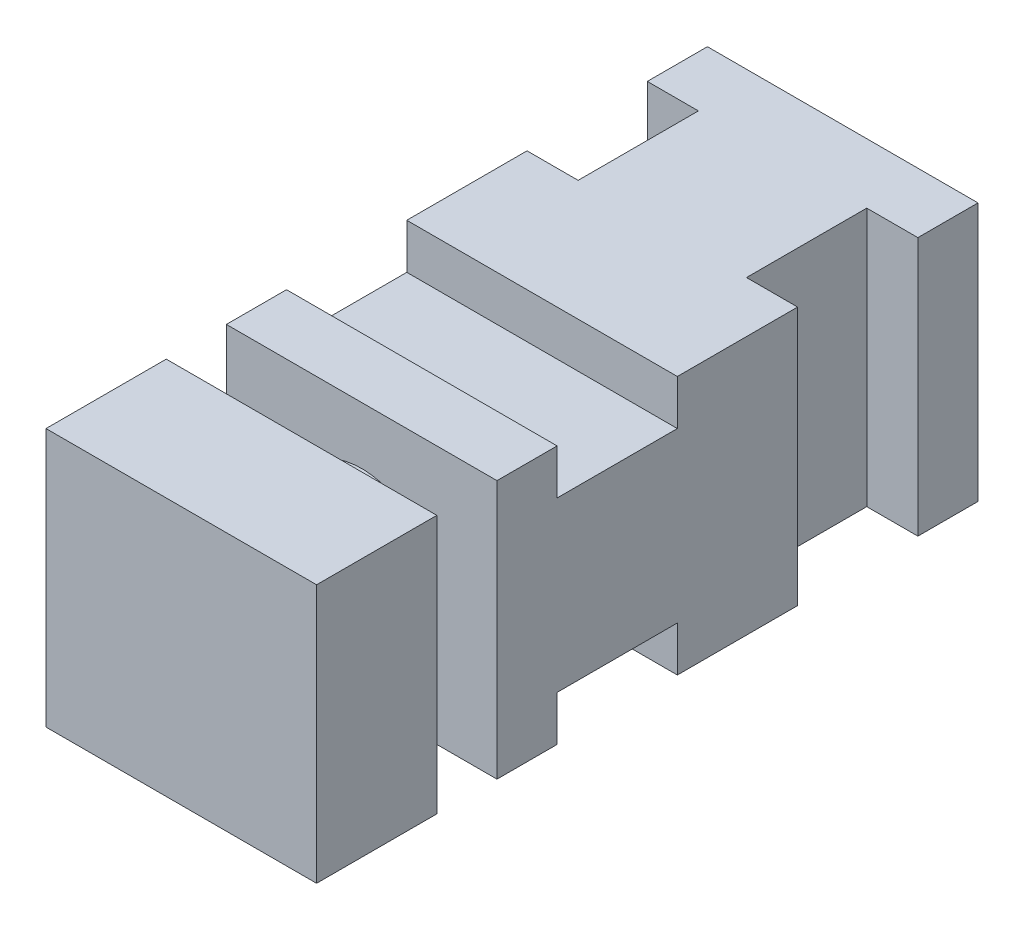
ISO-10303-21;
HEADER;
FILE_DESCRIPTION(('STEP AP214'),'2;1');
FILE_NAME('part.step','',(''),(''),'','','');
FILE_SCHEMA(('AUTOMOTIVE_DESIGN { 1 0 10303 214 1 1 1 1 }'));
ENDSEC;
DATA;
#1=APPLICATION_CONTEXT('core data for automotive mechanical design processes');
#2=APPLICATION_PROTOCOL_DEFINITION('international standard','automotive_design',2000,#1);
#3=PRODUCT_CONTEXT('',#1,'mechanical');
#4=PRODUCT('Part','Part','',(#3));
#5=PRODUCT_RELATED_PRODUCT_CATEGORY('part','',(#4));
#6=PRODUCT_DEFINITION_FORMATION('','',#4);
#7=PRODUCT_DEFINITION_CONTEXT('part definition',#1,'design');
#8=PRODUCT_DEFINITION('design','',#6,#7);
#9=PRODUCT_DEFINITION_SHAPE('','',#8);
#10=(LENGTH_UNIT() NAMED_UNIT(*) SI_UNIT(.MILLI.,.METRE.));
#11=(NAMED_UNIT(*) PLANE_ANGLE_UNIT() SI_UNIT($,.RADIAN.));
#12=(NAMED_UNIT(*) SI_UNIT($,.STERADIAN.) SOLID_ANGLE_UNIT());
#13=UNCERTAINTY_MEASURE_WITH_UNIT(LENGTH_MEASURE(1.E-05),#10,'distance_accuracy_value','');
#14=(GEOMETRIC_REPRESENTATION_CONTEXT(3) GLOBAL_UNCERTAINTY_ASSIGNED_CONTEXT((#13)) GLOBAL_UNIT_ASSIGNED_CONTEXT((#10,
#11,#12)) REPRESENTATION_CONTEXT('',''));
#15=CARTESIAN_POINT('',(0.,0.,0.));
#16=DIRECTION('',(0.,0.,1.));
#17=DIRECTION('',(1.,0.,0.));
#18=AXIS2_PLACEMENT_3D('',#15,#16,#17);
#19=CARTESIAN_POINT('',(-1.125,-1.075,-2.5));
#20=DIRECTION('',(1.,0.,0.));
#21=DIRECTION('',(0.,1.,0.));
#22=AXIS2_PLACEMENT_3D('',#19,#20,#21);
#23=PLANE('',#22);
#24=DIRECTION('',(0.,0.,1.));
#25=VECTOR('',#24,1.);
#26=CARTESIAN_POINT('',(-1.125,-1.075,-2.5));
#27=LINE('',#26,#25);
#28=CARTESIAN_POINT('',(-1.125,-1.075,-4.5));
#29=VERTEX_POINT('',#28);
#30=CARTESIAN_POINT('',(-1.125,-1.075,-4.));
#31=VERTEX_POINT('',#30);
#32=EDGE_CURVE('E393',#29,#31,#27,.T.);
#33=ORIENTED_EDGE('',*,*,#32,.T.);
#34=DIRECTION('',(0.,-1.,0.));
#35=VECTOR('',#34,1.);
#36=CARTESIAN_POINT('',(-1.125,1.075,-4.));
#37=LINE('',#36,#35);
#38=CARTESIAN_POINT('',(-1.125,1.075,-4.));
#39=VERTEX_POINT('',#38);
#40=EDGE_CURVE('E236',#39,#31,#37,.T.);
#41=ORIENTED_EDGE('',*,*,#40,.F.);
#42=DIRECTION('',(0.,0.,1.));
#43=VECTOR('',#42,1.);
#44=CARTESIAN_POINT('',(-1.125,1.075,-2.5));
#45=LINE('',#44,#43);
#46=CARTESIAN_POINT('',(-1.125,1.075,-4.5));
#47=VERTEX_POINT('',#46);
#48=EDGE_CURVE('E225',#47,#39,#45,.T.);
#49=ORIENTED_EDGE('',*,*,#48,.F.);
#50=DIRECTION('',(0.,1.,0.));
#51=VECTOR('',#50,1.);
#52=CARTESIAN_POINT('',(-1.125,-1.075,-4.5));
#53=LINE('',#52,#51);
#54=EDGE_CURVE('E285',#29,#47,#53,.T.);
#55=ORIENTED_EDGE('',*,*,#54,.F.);
#56=EDGE_LOOP('',(#33,#41,#49,#55));
#57=FACE_BOUND('',#56,.T.);
#58=ADVANCED_FACE('F39',(#57),#23,.F.);
#59=CARTESIAN_POINT('',(1.125,-1.075,-2.5));
#60=DIRECTION('',(-1.,0.,0.));
#61=DIRECTION('',(0.,-1.,0.));
#62=AXIS2_PLACEMENT_3D('',#59,#60,#61);
#63=PLANE('',#62);
#64=DIRECTION('',(0.,0.,1.));
#65=VECTOR('',#64,1.);
#66=CARTESIAN_POINT('',(1.125,1.075,-2.5));
#67=LINE('',#66,#65);
#68=CARTESIAN_POINT('',(1.125,1.075,-4.5));
#69=VERTEX_POINT('',#68);
#70=CARTESIAN_POINT('',(1.125,1.075,-4.));
#71=VERTEX_POINT('',#70);
#72=EDGE_CURVE('E405',#69,#71,#67,.T.);
#73=ORIENTED_EDGE('',*,*,#72,.T.);
#74=DIRECTION('',(0.,-1.,0.));
#75=VECTOR('',#74,1.);
#76=CARTESIAN_POINT('',(1.125,1.075,-4.));
#77=LINE('',#76,#75);
#78=CARTESIAN_POINT('',(1.125,-1.075,-4.));
#79=VERTEX_POINT('',#78);
#80=EDGE_CURVE('E227',#71,#79,#77,.T.);
#81=ORIENTED_EDGE('',*,*,#80,.T.);
#82=DIRECTION('',(0.,0.,1.));
#83=VECTOR('',#82,1.);
#84=CARTESIAN_POINT('',(1.125,-1.075,-2.5));
#85=LINE('',#84,#83);
#86=CARTESIAN_POINT('',(1.125,-1.075,-4.5));
#87=VERTEX_POINT('',#86);
#88=EDGE_CURVE('E399',#87,#79,#85,.T.);
#89=ORIENTED_EDGE('',*,*,#88,.F.);
#90=DIRECTION('',(0.,-1.,0.));
#91=VECTOR('',#90,1.);
#92=CARTESIAN_POINT('',(1.125,-1.075,-4.5));
#93=LINE('',#92,#91);
#94=EDGE_CURVE('E293',#69,#87,#93,.T.);
#95=ORIENTED_EDGE('',*,*,#94,.F.);
#96=EDGE_LOOP('',(#73,#81,#89,#95));
#97=FACE_BOUND('',#96,.T.);
#98=ADVANCED_FACE('F489',(#97),#63,.F.);
#99=CARTESIAN_POINT('',(-1.125,1.075,-3.));
#100=VERTEX_POINT('',#99);
#101=CARTESIAN_POINT('',(-1.125,1.075,-2.));
#102=VERTEX_POINT('',#101);
#103=EDGE_CURVE('E414',#100,#102,#45,.T.);
#104=ORIENTED_EDGE('',*,*,#103,.F.);
#105=DIRECTION('',(0.,-1.,0.));
#106=VECTOR('',#105,1.);
#107=CARTESIAN_POINT('',(-1.125,1.075,-3.));
#108=LINE('',#107,#106);
#109=CARTESIAN_POINT('',(-1.125,-1.075,-3.));
#110=VERTEX_POINT('',#109);
#111=EDGE_CURVE('E240',#100,#110,#108,.T.);
#112=ORIENTED_EDGE('',*,*,#111,.T.);
#113=CARTESIAN_POINT('',(-1.125,-1.075,-2.));
#114=VERTEX_POINT('',#113);
#115=EDGE_CURVE('E398',#110,#114,#27,.T.);
#116=ORIENTED_EDGE('',*,*,#115,.T.);
#117=DIRECTION('',(0.,-1.,0.));
#118=VECTOR('',#117,1.);
#119=CARTESIAN_POINT('',(-1.125,-1.075,-2.));
#120=LINE('',#119,#118);
#121=CARTESIAN_POINT('',(-1.125,-0.7,-2.));
#122=VERTEX_POINT('',#121);
#123=EDGE_CURVE('E358',#122,#114,#120,.T.);
#124=ORIENTED_EDGE('',*,*,#123,.F.);
#125=DIRECTION('',(0.,0.,1.));
#126=VECTOR('',#125,1.);
#127=CARTESIAN_POINT('',(-1.125,-0.7,-2.5));
#128=LINE('',#127,#126);
#129=CARTESIAN_POINT('',(-1.125,-0.7,-1.));
#130=VERTEX_POINT('',#129);
#131=EDGE_CURVE('E372',#122,#130,#128,.T.);
#132=ORIENTED_EDGE('',*,*,#131,.T.);
#133=DIRECTION('',(0.,-1.,0.));
#134=VECTOR('',#133,1.);
#135=CARTESIAN_POINT('',(-1.125,-1.075,-1.));
#136=LINE('',#135,#134);
#137=CARTESIAN_POINT('',(-1.125,-1.075,-1.));
#138=VERTEX_POINT('',#137);
#139=EDGE_CURVE('E319',#130,#138,#136,.T.);
#140=ORIENTED_EDGE('',*,*,#139,.T.);
#141=CARTESIAN_POINT('',(-1.125,-1.075,-0.5));
#142=VERTEX_POINT('',#141);
#143=EDGE_CURVE('E392',#138,#142,#27,.T.);
#144=ORIENTED_EDGE('',*,*,#143,.T.);
#145=DIRECTION('',(0.,1.,0.));
#146=VECTOR('',#145,1.);
#147=CARTESIAN_POINT('',(-1.125,-1.075,-0.5));
#148=LINE('',#147,#146);
#149=CARTESIAN_POINT('',(-1.125,1.075,-0.5));
#150=VERTEX_POINT('',#149);
#151=EDGE_CURVE('E376',#142,#150,#148,.T.);
#152=ORIENTED_EDGE('',*,*,#151,.T.);
#153=CARTESIAN_POINT('',(-1.125,1.075,-1.));
#154=VERTEX_POINT('',#153);
#155=EDGE_CURVE('E409',#154,#150,#45,.T.);
#156=ORIENTED_EDGE('',*,*,#155,.F.);
#157=DIRECTION('',(0.,1.,0.));
#158=VECTOR('',#157,1.);
#159=CARTESIAN_POINT('',(-1.125,-1.075,-1.));
#160=LINE('',#159,#158);
#161=CARTESIAN_POINT('',(-1.125,0.7,-1.));
#162=VERTEX_POINT('',#161);
#163=EDGE_CURVE('E369',#162,#154,#160,.T.);
#164=ORIENTED_EDGE('',*,*,#163,.F.);
#165=DIRECTION('',(0.,0.,1.));
#166=VECTOR('',#165,1.);
#167=CARTESIAN_POINT('',(-1.125,0.7,-2.5));
#168=LINE('',#167,#166);
#169=CARTESIAN_POINT('',(-1.125,0.7,-2.));
#170=VERTEX_POINT('',#169);
#171=EDGE_CURVE('E366',#170,#162,#168,.T.);
#172=ORIENTED_EDGE('',*,*,#171,.F.);
#173=DIRECTION('',(0.,1.,0.));
#174=VECTOR('',#173,1.);
#175=CARTESIAN_POINT('',(-1.125,-1.075,-2.));
#176=LINE('',#175,#174);
#177=EDGE_CURVE('E362',#170,#102,#176,.T.);
#178=ORIENTED_EDGE('',*,*,#177,.T.);
#179=EDGE_LOOP('',(#104,#112,#116,#124,#132,#140,#144,#152,#156,#164,#172,#178));
#180=FACE_BOUND('',#179,.T.);
#181=ADVANCED_FACE('F492',(#180),#23,.F.);
#182=CARTESIAN_POINT('',(1.125,1.075,-2.5));
#183=DIRECTION('',(0.,-1.,0.));
#184=DIRECTION('',(0.,0.,-1.));
#185=AXIS2_PLACEMENT_3D('',#182,#183,#184);
#186=PLANE('',#185);
#187=DIRECTION('',(-1.,0.,0.));
#188=VECTOR('',#187,1.);
#189=CARTESIAN_POINT('',(1.125,1.075,-1.));
#190=LINE('',#189,#188);
#191=CARTESIAN_POINT('',(1.125,1.075,-1.));
#192=VERTEX_POINT('',#191);
#193=EDGE_CURVE('E307',#192,#154,#190,.T.);
#194=ORIENTED_EDGE('',*,*,#193,.T.);
#195=ORIENTED_EDGE('',*,*,#155,.T.);
#196=DIRECTION('',(1.,0.,0.));
#197=VECTOR('',#196,1.);
#198=CARTESIAN_POINT('',(1.125,1.075,-0.5));
#199=LINE('',#198,#197);
#200=CARTESIAN_POINT('',(1.125,1.075,-0.5));
#201=VERTEX_POINT('',#200);
#202=EDGE_CURVE('E380',#150,#201,#199,.T.);
#203=ORIENTED_EDGE('',*,*,#202,.T.);
#204=EDGE_CURVE('E403',#192,#201,#67,.T.);
#205=ORIENTED_EDGE('',*,*,#204,.F.);
#206=EDGE_LOOP('',(#194,#195,#203,#205));
#207=FACE_BOUND('',#206,.T.);
#208=ADVANCED_FACE('F501',(#207),#186,.F.);
#209=CARTESIAN_POINT('',(1.125,-1.075,-3.));
#210=VERTEX_POINT('',#209);
#211=CARTESIAN_POINT('',(1.125,-1.075,-2.));
#212=VERTEX_POINT('',#211);
#213=EDGE_CURVE('E404',#210,#212,#85,.T.);
#214=ORIENTED_EDGE('',*,*,#213,.F.);
#215=DIRECTION('',(0.,-1.,0.));
#216=VECTOR('',#215,1.);
#217=CARTESIAN_POINT('',(1.125,1.075,-3.));
#218=LINE('',#217,#216);
#219=CARTESIAN_POINT('',(1.125,1.075,-3.));
#220=VERTEX_POINT('',#219);
#221=EDGE_CURVE('E255',#220,#210,#218,.T.);
#222=ORIENTED_EDGE('',*,*,#221,.F.);
#223=CARTESIAN_POINT('',(1.125,1.075,-2.));
#224=VERTEX_POINT('',#223);
#225=EDGE_CURVE('E410',#220,#224,#67,.T.);
#226=ORIENTED_EDGE('',*,*,#225,.T.);
#227=DIRECTION('',(0.,-1.,0.));
#228=VECTOR('',#227,1.);
#229=CARTESIAN_POINT('',(1.125,0.,-2.));
#230=LINE('',#229,#228);
#231=CARTESIAN_POINT('',(1.125,0.699999999999999,-2.));
#232=VERTEX_POINT('',#231);
#233=EDGE_CURVE('E301',#224,#232,#230,.T.);
#234=ORIENTED_EDGE('',*,*,#233,.T.);
#235=DIRECTION('',(0.,0.,-1.));
#236=VECTOR('',#235,1.);
#237=CARTESIAN_POINT('',(1.125,0.699999999999999,0.));
#238=LINE('',#237,#236);
#239=CARTESIAN_POINT('',(1.125,0.699999999999999,-1.));
#240=VERTEX_POINT('',#239);
#241=EDGE_CURVE('E333',#240,#232,#238,.T.);
#242=ORIENTED_EDGE('',*,*,#241,.F.);
#243=DIRECTION('',(0.,-1.,0.));
#244=VECTOR('',#243,1.);
#245=CARTESIAN_POINT('',(1.125,0.,-1.));
#246=LINE('',#245,#244);
#247=EDGE_CURVE('E337',#192,#240,#246,.T.);
#248=ORIENTED_EDGE('',*,*,#247,.F.);
#249=ORIENTED_EDGE('',*,*,#204,.T.);
#250=DIRECTION('',(0.,-1.,0.));
#251=VECTOR('',#250,1.);
#252=CARTESIAN_POINT('',(1.125,-1.075,-0.5));
#253=LINE('',#252,#251);
#254=CARTESIAN_POINT('',(1.125,-1.075,-0.5));
#255=VERTEX_POINT('',#254);
#256=EDGE_CURVE('E384',#201,#255,#253,.T.);
#257=ORIENTED_EDGE('',*,*,#256,.T.);
#258=CARTESIAN_POINT('',(1.125,-1.075,-1.));
#259=VERTEX_POINT('',#258);
#260=EDGE_CURVE('E397',#259,#255,#85,.T.);
#261=ORIENTED_EDGE('',*,*,#260,.F.);
#262=DIRECTION('',(0.,1.,0.));
#263=VECTOR('',#262,1.);
#264=CARTESIAN_POINT('',(1.125,0.,-1.));
#265=LINE('',#264,#263);
#266=CARTESIAN_POINT('',(1.125,-0.7,-1.));
#267=VERTEX_POINT('',#266);
#268=EDGE_CURVE('E302',#259,#267,#265,.T.);
#269=ORIENTED_EDGE('',*,*,#268,.T.);
#270=DIRECTION('',(0.,0.,-1.));
#271=VECTOR('',#270,1.);
#272=CARTESIAN_POINT('',(1.125,-0.7,0.));
#273=LINE('',#272,#271);
#274=CARTESIAN_POINT('',(1.125,-0.7,-2.));
#275=VERTEX_POINT('',#274);
#276=EDGE_CURVE('E306',#267,#275,#273,.T.);
#277=ORIENTED_EDGE('',*,*,#276,.T.);
#278=DIRECTION('',(0.,1.,0.));
#279=VECTOR('',#278,1.);
#280=CARTESIAN_POINT('',(1.125,0.,-2.));
#281=LINE('',#280,#279);
#282=EDGE_CURVE('E311',#212,#275,#281,.T.);
#283=ORIENTED_EDGE('',*,*,#282,.F.);
#284=EDGE_LOOP('',(#214,#222,#226,#234,#242,#248,#249,#257,#261,#269,#277,#283));
#285=FACE_BOUND('',#284,.T.);
#286=ADVANCED_FACE('F498',(#285),#63,.F.);
#287=CARTESIAN_POINT('',(1.125,-1.075,-2.5));
#288=DIRECTION('',(0.,1.,0.));
#289=DIRECTION('',(0.,0.,1.));
#290=AXIS2_PLACEMENT_3D('',#287,#288,#289);
#291=PLANE('',#290);
#292=DIRECTION('',(0.,0.,-1.));
#293=VECTOR('',#292,1.);
#294=CARTESIAN_POINT('',(-0.7,-1.075,-2.5));
#295=LINE('',#294,#293);
#296=CARTESIAN_POINT('',(-0.7,-1.075,-3.));
#297=VERTEX_POINT('',#296);
#298=CARTESIAN_POINT('',(-0.7,-1.075,-4.));
#299=VERTEX_POINT('',#298);
#300=EDGE_CURVE('E276',#297,#299,#295,.T.);
#301=ORIENTED_EDGE('',*,*,#300,.T.);
#302=DIRECTION('',(-1.,0.,0.));
#303=VECTOR('',#302,1.);
#304=CARTESIAN_POINT('',(1.125,-1.075,-4.));
#305=LINE('',#304,#303);
#306=EDGE_CURVE('E210',#299,#31,#305,.T.);
#307=ORIENTED_EDGE('',*,*,#306,.T.);
#308=ORIENTED_EDGE('',*,*,#32,.F.);
#309=DIRECTION('',(-1.,0.,0.));
#310=VECTOR('',#309,1.);
#311=CARTESIAN_POINT('',(1.125,-1.075,-4.5));
#312=LINE('',#311,#310);
#313=EDGE_CURVE('E297',#87,#29,#312,.T.);
#314=ORIENTED_EDGE('',*,*,#313,.F.);
#315=ORIENTED_EDGE('',*,*,#88,.T.);
#316=DIRECTION('',(-1.,0.,0.));
#317=VECTOR('',#316,1.);
#318=CARTESIAN_POINT('',(1.125,-1.075,-4.));
#319=LINE('',#318,#317);
#320=CARTESIAN_POINT('',(0.7,-1.075,-4.));
#321=VERTEX_POINT('',#320);
#322=EDGE_CURVE('E272',#79,#321,#319,.T.);
#323=ORIENTED_EDGE('',*,*,#322,.T.);
#324=DIRECTION('',(0.,0.,1.));
#325=VECTOR('',#324,1.);
#326=CARTESIAN_POINT('',(0.7,-1.075,-2.5));
#327=LINE('',#326,#325);
#328=CARTESIAN_POINT('',(0.7,-1.075,-3.));
#329=VERTEX_POINT('',#328);
#330=EDGE_CURVE('E268',#321,#329,#327,.T.);
#331=ORIENTED_EDGE('',*,*,#330,.T.);
#332=DIRECTION('',(1.,0.,0.));
#333=VECTOR('',#332,1.);
#334=CARTESIAN_POINT('',(1.125,-1.075,-3.));
#335=LINE('',#334,#333);
#336=EDGE_CURVE('E239',#329,#210,#335,.T.);
#337=ORIENTED_EDGE('',*,*,#336,.T.);
#338=ORIENTED_EDGE('',*,*,#213,.T.);
#339=DIRECTION('',(-1.,0.,0.));
#340=VECTOR('',#339,1.);
#341=CARTESIAN_POINT('',(1.125,-1.075,-2.));
#342=LINE('',#341,#340);
#343=EDGE_CURVE('E315',#212,#114,#342,.T.);
#344=ORIENTED_EDGE('',*,*,#343,.T.);
#345=ORIENTED_EDGE('',*,*,#115,.F.);
#346=DIRECTION('',(1.,0.,0.));
#347=VECTOR('',#346,1.);
#348=CARTESIAN_POINT('',(1.125,-1.075,-3.));
#349=LINE('',#348,#347);
#350=EDGE_CURVE('E279',#110,#297,#349,.T.);
#351=ORIENTED_EDGE('',*,*,#350,.T.);
#352=EDGE_LOOP('',(#301,#307,#308,#314,#315,#323,#331,#337,#338,#344,#345,#351));
#353=FACE_BOUND('',#352,.T.);
#354=ADVANCED_FACE('F566',(#353),#291,.F.);
#355=CARTESIAN_POINT('',(1.125,-1.075,1.));
#356=DIRECTION('',(-1.,0.,0.));
#357=DIRECTION('',(0.,-1.,0.));
#358=AXIS2_PLACEMENT_3D('',#355,#356,#357);
#359=PLANE('',#358);
#360=DIRECTION('',(0.,1.,0.));
#361=VECTOR('',#360,1.);
#362=CARTESIAN_POINT('',(1.125,-1.075,0.));
#363=LINE('',#362,#361);
#364=CARTESIAN_POINT('',(1.125,-1.075,0.));
#365=VERTEX_POINT('',#364);
#366=CARTESIAN_POINT('',(1.125,1.075,0.));
#367=VERTEX_POINT('',#366);
#368=EDGE_CURVE('E417',#365,#367,#363,.T.);
#369=ORIENTED_EDGE('',*,*,#368,.T.);
#370=DIRECTION('',(0.,0.,-1.));
#371=VECTOR('',#370,1.);
#372=CARTESIAN_POINT('',(1.125,1.075,1.));
#373=LINE('',#372,#371);
#374=CARTESIAN_POINT('',(1.125,1.075,1.));
#375=VERTEX_POINT('',#374);
#376=EDGE_CURVE('E43',#375,#367,#373,.T.);
#377=ORIENTED_EDGE('',*,*,#376,.F.);
#378=DIRECTION('',(0.,1.,0.));
#379=VECTOR('',#378,1.);
#380=CARTESIAN_POINT('',(1.125,-1.075,1.));
#381=LINE('',#380,#379);
#382=CARTESIAN_POINT('',(1.125,-1.075,1.));
#383=VERTEX_POINT('',#382);
#384=EDGE_CURVE('E419',#383,#375,#381,.T.);
#385=ORIENTED_EDGE('',*,*,#384,.F.);
#386=DIRECTION('',(0.,0.,-1.));
#387=VECTOR('',#386,1.);
#388=CARTESIAN_POINT('',(1.125,-1.075,1.));
#389=LINE('',#388,#387);
#390=EDGE_CURVE('E433',#383,#365,#389,.T.);
#391=ORIENTED_EDGE('',*,*,#390,.T.);
#392=EDGE_LOOP('',(#369,#377,#385,#391));
#393=FACE_BOUND('',#392,.T.);
#394=ADVANCED_FACE('F41',(#393),#359,.F.);
#395=CARTESIAN_POINT('',(-1.125,1.075,1.));
#396=DIRECTION('',(0.,-1.,0.));
#397=DIRECTION('',(1.,0.,0.));
#398=AXIS2_PLACEMENT_3D('',#395,#396,#397);
#399=PLANE('',#398);
#400=DIRECTION('',(-1.,0.,0.));
#401=VECTOR('',#400,1.);
#402=CARTESIAN_POINT('',(-1.125,1.075,0.));
#403=LINE('',#402,#401);
#404=CARTESIAN_POINT('',(-1.125,1.075,0.));
#405=VERTEX_POINT('',#404);
#406=EDGE_CURVE('E437',#367,#405,#403,.T.);
#407=ORIENTED_EDGE('',*,*,#406,.T.);
#408=DIRECTION('',(0.,0.,-1.));
#409=VECTOR('',#408,1.);
#410=CARTESIAN_POINT('',(-1.125,1.075,1.));
#411=LINE('',#410,#409);
#412=CARTESIAN_POINT('',(-1.125,1.075,1.));
#413=VERTEX_POINT('',#412);
#414=EDGE_CURVE('E451',#413,#405,#411,.T.);
#415=ORIENTED_EDGE('',*,*,#414,.F.);
#416=DIRECTION('',(-1.,0.,0.));
#417=VECTOR('',#416,1.);
#418=CARTESIAN_POINT('',(-1.125,1.075,1.));
#419=LINE('',#418,#417);
#420=EDGE_CURVE('E423',#375,#413,#419,.T.);
#421=ORIENTED_EDGE('',*,*,#420,.F.);
#422=ORIENTED_EDGE('',*,*,#376,.T.);
#423=EDGE_LOOP('',(#407,#415,#421,#422));
#424=FACE_BOUND('',#423,.T.);
#425=ADVANCED_FACE('F462',(#424),#399,.F.);
#426=CARTESIAN_POINT('',(-1.125,-1.075,1.));
#427=DIRECTION('',(1.,0.,0.));
#428=DIRECTION('',(0.,0.,-1.));
#429=AXIS2_PLACEMENT_3D('',#426,#427,#428);
#430=PLANE('',#429);
#431=DIRECTION('',(0.,-1.,0.));
#432=VECTOR('',#431,1.);
#433=CARTESIAN_POINT('',(-1.125,-1.075,0.));
#434=LINE('',#433,#432);
#435=CARTESIAN_POINT('',(-1.125,-1.075,0.));
#436=VERTEX_POINT('',#435);
#437=EDGE_CURVE('E440',#405,#436,#434,.T.);
#438=ORIENTED_EDGE('',*,*,#437,.T.);
#439=DIRECTION('',(0.,0.,-1.));
#440=VECTOR('',#439,1.);
#441=CARTESIAN_POINT('',(-1.125,-1.075,1.));
#442=LINE('',#441,#440);
#443=CARTESIAN_POINT('',(-1.125,-1.075,1.));
#444=VERTEX_POINT('',#443);
#445=EDGE_CURVE('E448',#444,#436,#442,.T.);
#446=ORIENTED_EDGE('',*,*,#445,.F.);
#447=DIRECTION('',(0.,-1.,0.));
#448=VECTOR('',#447,1.);
#449=CARTESIAN_POINT('',(-1.125,-1.075,1.));
#450=LINE('',#449,#448);
#451=EDGE_CURVE('E427',#413,#444,#450,.T.);
#452=ORIENTED_EDGE('',*,*,#451,.F.);
#453=ORIENTED_EDGE('',*,*,#414,.T.);
#454=EDGE_LOOP('',(#438,#446,#452,#453));
#455=FACE_BOUND('',#454,.T.);
#456=ADVANCED_FACE('F471',(#455),#430,.F.);
#457=CARTESIAN_POINT('',(-1.125,-1.075,1.));
#458=DIRECTION('',(0.,1.,0.));
#459=DIRECTION('',(-1.,0.,0.));
#460=AXIS2_PLACEMENT_3D('',#457,#458,#459);
#461=PLANE('',#460);
#462=DIRECTION('',(1.,0.,0.));
#463=VECTOR('',#462,1.);
#464=CARTESIAN_POINT('',(-1.125,-1.075,0.));
#465=LINE('',#464,#463);
#466=EDGE_CURVE('E424',#436,#365,#465,.T.);
#467=ORIENTED_EDGE('',*,*,#466,.T.);
#468=ORIENTED_EDGE('',*,*,#390,.F.);
#469=DIRECTION('',(1.,0.,0.));
#470=VECTOR('',#469,1.);
#471=CARTESIAN_POINT('',(-1.125,-1.075,1.));
#472=LINE('',#471,#470);
#473=EDGE_CURVE('E430',#444,#383,#472,.T.);
#474=ORIENTED_EDGE('',*,*,#473,.F.);
#475=ORIENTED_EDGE('',*,*,#445,.T.);
#476=EDGE_LOOP('',(#467,#468,#474,#475));
#477=FACE_BOUND('',#476,.T.);
#478=ADVANCED_FACE('F474',(#477),#461,.F.);
#479=CARTESIAN_POINT('',(0.,0.,1.));
#480=DIRECTION('',(0.,0.,-1.));
#481=DIRECTION('',(-1.,0.,0.));
#482=AXIS2_PLACEMENT_3D('',#479,#480,#481);
#483=PLANE('',#482);
#484=ORIENTED_EDGE('',*,*,#384,.T.);
#485=ORIENTED_EDGE('',*,*,#420,.T.);
#486=ORIENTED_EDGE('',*,*,#451,.T.);
#487=ORIENTED_EDGE('',*,*,#473,.T.);
#488=EDGE_LOOP('',(#484,#485,#486,#487));
#489=FACE_BOUND('',#488,.T.);
#490=ADVANCED_FACE('F476',(#489),#483,.F.);
#491=CARTESIAN_POINT('',(0.,0.,0.));
#492=DIRECTION('',(0.,0.,-1.));
#493=DIRECTION('',(-1.,0.,0.));
#494=AXIS2_PLACEMENT_3D('',#491,#492,#493);
#495=PLANE('',#494);
#496=CARTESIAN_POINT('',(0.,0.,0.));
#497=DIRECTION('',(0.,0.,-1.));
#498=DIRECTION('',(-1.,0.,0.));
#499=AXIS2_PLACEMENT_3D('',#496,#497,#498);
#500=CIRCLE('',#499,0.6);
#501=CARTESIAN_POINT('',(-0.6,0.,0.));
#502=VERTEX_POINT('',#501);
#503=EDGE_CURVE('E11',#502,#502,#500,.T.);
#504=ORIENTED_EDGE('',*,*,#503,.F.);
#505=EDGE_LOOP('',(#504));
#506=FACE_BOUND('',#505,.T.);
#507=ORIENTED_EDGE('',*,*,#368,.F.);
#508=ORIENTED_EDGE('',*,*,#466,.F.);
#509=ORIENTED_EDGE('',*,*,#437,.F.);
#510=ORIENTED_EDGE('',*,*,#406,.F.);
#511=EDGE_LOOP('',(#507,#508,#509,#510));
#512=FACE_BOUND('',#511,.T.);
#513=ADVANCED_FACE('F469',(#506,#512),#495,.T.);
#514=CARTESIAN_POINT('',(0.,0.,-0.5));
#515=DIRECTION('',(0.,0.,1.));
#516=DIRECTION('',(1.,0.,0.));
#517=AXIS2_PLACEMENT_3D('',#514,#515,#516);
#518=CYLINDRICAL_SURFACE('',#517,0.6);
#519=CARTESIAN_POINT('',(0.,0.,-0.5));
#520=DIRECTION('',(0.,0.,-1.));
#521=DIRECTION('',(-1.,0.,0.));
#522=AXIS2_PLACEMENT_3D('',#519,#520,#521);
#523=CIRCLE('',#522,0.6);
#524=CARTESIAN_POINT('',(-0.6,0.,-0.5));
#525=VERTEX_POINT('',#524);
#526=EDGE_CURVE('E413',#525,#525,#523,.T.);
#527=ORIENTED_EDGE('',*,*,#526,.F.);
#528=EDGE_LOOP('',(#527));
#529=FACE_BOUND('',#528,.T.);
#530=ORIENTED_EDGE('',*,*,#503,.T.);
#531=EDGE_LOOP('',(#530));
#532=FACE_BOUND('',#531,.T.);
#533=ADVANCED_FACE('F483',(#529,#532),#518,.T.);
#534=ORIENTED_EDGE('',*,*,#48,.T.);
#535=DIRECTION('',(1.,0.,0.));
#536=VECTOR('',#535,1.);
#537=CARTESIAN_POINT('',(-1.125,1.075,-4.));
#538=LINE('',#537,#536);
#539=CARTESIAN_POINT('',(-0.7,1.075,-4.));
#540=VERTEX_POINT('',#539);
#541=EDGE_CURVE('E207',#39,#540,#538,.T.);
#542=ORIENTED_EDGE('',*,*,#541,.T.);
#543=DIRECTION('',(0.,0.,1.));
#544=VECTOR('',#543,1.);
#545=CARTESIAN_POINT('',(-0.7,1.075,-3.));
#546=LINE('',#545,#544);
#547=CARTESIAN_POINT('',(-0.7,1.075,-3.));
#548=VERTEX_POINT('',#547);
#549=EDGE_CURVE('E217',#540,#548,#546,.T.);
#550=ORIENTED_EDGE('',*,*,#549,.T.);
#551=DIRECTION('',(-1.,0.,0.));
#552=VECTOR('',#551,1.);
#553=CARTESIAN_POINT('',(-1.125,1.075,-3.));
#554=LINE('',#553,#552);
#555=EDGE_CURVE('E56',#548,#100,#554,.T.);
#556=ORIENTED_EDGE('',*,*,#555,.T.);
#557=ORIENTED_EDGE('',*,*,#103,.T.);
#558=DIRECTION('',(-1.,0.,0.));
#559=VECTOR('',#558,1.);
#560=CARTESIAN_POINT('',(1.125,1.075,-2.));
#561=LINE('',#560,#559);
#562=EDGE_CURVE('E340',#224,#102,#561,.T.);
#563=ORIENTED_EDGE('',*,*,#562,.F.);
#564=ORIENTED_EDGE('',*,*,#225,.F.);
#565=DIRECTION('',(-1.,0.,0.));
#566=VECTOR('',#565,1.);
#567=CARTESIAN_POINT('',(1.125,1.075,-3.));
#568=LINE('',#567,#566);
#569=CARTESIAN_POINT('',(0.7,1.075,-3.));
#570=VERTEX_POINT('',#569);
#571=EDGE_CURVE('E246',#220,#570,#568,.T.);
#572=ORIENTED_EDGE('',*,*,#571,.T.);
#573=DIRECTION('',(0.,0.,-1.));
#574=VECTOR('',#573,1.);
#575=CARTESIAN_POINT('',(0.7,1.075,-3.));
#576=LINE('',#575,#574);
#577=CARTESIAN_POINT('',(0.7,1.075,-4.));
#578=VERTEX_POINT('',#577);
#579=EDGE_CURVE('E64',#570,#578,#576,.T.);
#580=ORIENTED_EDGE('',*,*,#579,.T.);
#581=DIRECTION('',(1.,0.,0.));
#582=VECTOR('',#581,1.);
#583=CARTESIAN_POINT('',(1.125,1.075,-4.));
#584=LINE('',#583,#582);
#585=EDGE_CURVE('E252',#578,#71,#584,.T.);
#586=ORIENTED_EDGE('',*,*,#585,.T.);
#587=ORIENTED_EDGE('',*,*,#72,.F.);
#588=DIRECTION('',(1.,0.,0.));
#589=VECTOR('',#588,1.);
#590=CARTESIAN_POINT('',(1.125,1.075,-4.5));
#591=LINE('',#590,#589);
#592=EDGE_CURVE('E289',#47,#69,#591,.T.);
#593=ORIENTED_EDGE('',*,*,#592,.F.);
#594=EDGE_LOOP('',(#534,#542,#550,#556,#557,#563,#564,#572,#580,#586,#587,#593));
#595=FACE_BOUND('',#594,.T.);
#596=ADVANCED_FACE('F223',(#595),#186,.F.);
#597=ORIENTED_EDGE('',*,*,#143,.F.);
#598=DIRECTION('',(-1.,0.,0.));
#599=VECTOR('',#598,1.);
#600=CARTESIAN_POINT('',(1.125,-1.075,-1.));
#601=LINE('',#600,#599);
#602=EDGE_CURVE('E314',#259,#138,#601,.T.);
#603=ORIENTED_EDGE('',*,*,#602,.F.);
#604=ORIENTED_EDGE('',*,*,#260,.T.);
#605=DIRECTION('',(-1.,0.,0.));
#606=VECTOR('',#605,1.);
#607=CARTESIAN_POINT('',(1.125,-1.075,-0.5));
#608=LINE('',#607,#606);
#609=EDGE_CURVE('E388',#255,#142,#608,.T.);
#610=ORIENTED_EDGE('',*,*,#609,.T.);
#611=EDGE_LOOP('',(#597,#603,#604,#610));
#612=FACE_BOUND('',#611,.T.);
#613=ADVANCED_FACE('F526',(#612),#291,.F.);
#614=CARTESIAN_POINT('',(0.,0.,-0.5));
#615=DIRECTION('',(0.,0.,1.));
#616=DIRECTION('',(1.,0.,0.));
#617=AXIS2_PLACEMENT_3D('',#614,#615,#616);
#618=PLANE('',#617);
#619=ORIENTED_EDGE('',*,*,#526,.T.);
#620=EDGE_LOOP('',(#619));
#621=FACE_BOUND('',#620,.T.);
#622=ORIENTED_EDGE('',*,*,#151,.F.);
#623=ORIENTED_EDGE('',*,*,#609,.F.);
#624=ORIENTED_EDGE('',*,*,#256,.F.);
#625=ORIENTED_EDGE('',*,*,#202,.F.);
#626=EDGE_LOOP('',(#622,#623,#624,#625));
#627=FACE_BOUND('',#626,.T.);
#628=ADVANCED_FACE('F520',(#621,#627),#618,.T.);
#629=CARTESIAN_POINT('',(1.125,-0.7,0.));
#630=DIRECTION('',(0.,1.,0.));
#631=DIRECTION('',(-1.,0.,0.));
#632=AXIS2_PLACEMENT_3D('',#629,#630,#631);
#633=PLANE('',#632);
#634=DIRECTION('',(-1.,0.,0.));
#635=VECTOR('',#634,1.);
#636=CARTESIAN_POINT('',(1.125,-0.7,-2.));
#637=LINE('',#636,#635);
#638=EDGE_CURVE('E320',#275,#122,#637,.T.);
#639=ORIENTED_EDGE('',*,*,#638,.F.);
#640=ORIENTED_EDGE('',*,*,#276,.F.);
#641=DIRECTION('',(-1.,0.,0.));
#642=VECTOR('',#641,1.);
#643=CARTESIAN_POINT('',(1.125,-0.7,-1.));
#644=LINE('',#643,#642);
#645=EDGE_CURVE('E324',#267,#130,#644,.T.);
#646=ORIENTED_EDGE('',*,*,#645,.T.);
#647=ORIENTED_EDGE('',*,*,#131,.F.);
#648=EDGE_LOOP('',(#639,#640,#646,#647));
#649=FACE_BOUND('',#648,.T.);
#650=ADVANCED_FACE('F563',(#649),#633,.F.);
#651=CARTESIAN_POINT('',(1.125,0.,-2.));
#652=DIRECTION('',(0.,0.,1.));
#653=DIRECTION('',(1.,0.,0.));
#654=AXIS2_PLACEMENT_3D('',#651,#652,#653);
#655=PLANE('',#654);
#656=ORIENTED_EDGE('',*,*,#123,.T.);
#657=ORIENTED_EDGE('',*,*,#343,.F.);
#658=ORIENTED_EDGE('',*,*,#282,.T.);
#659=ORIENTED_EDGE('',*,*,#638,.T.);
#660=EDGE_LOOP('',(#656,#657,#658,#659));
#661=FACE_BOUND('',#660,.T.);
#662=ADVANCED_FACE('F553',(#661),#655,.T.);
#663=CARTESIAN_POINT('',(1.125,0.,-1.));
#664=DIRECTION('',(0.,0.,1.));
#665=DIRECTION('',(0.,-1.,0.));
#666=AXIS2_PLACEMENT_3D('',#663,#664,#665);
#667=PLANE('',#666);
#668=ORIENTED_EDGE('',*,*,#645,.F.);
#669=ORIENTED_EDGE('',*,*,#268,.F.);
#670=ORIENTED_EDGE('',*,*,#602,.T.);
#671=ORIENTED_EDGE('',*,*,#139,.F.);
#672=EDGE_LOOP('',(#668,#669,#670,#671));
#673=FACE_BOUND('',#672,.T.);
#674=ADVANCED_FACE('F546',(#673),#667,.F.);
#675=CARTESIAN_POINT('',(1.125,0.,-1.));
#676=DIRECTION('',(0.,0.,-1.));
#677=DIRECTION('',(0.,1.,0.));
#678=AXIS2_PLACEMENT_3D('',#675,#676,#677);
#679=PLANE('',#678);
#680=ORIENTED_EDGE('',*,*,#163,.T.);
#681=ORIENTED_EDGE('',*,*,#193,.F.);
#682=ORIENTED_EDGE('',*,*,#247,.T.);
#683=DIRECTION('',(-1.,0.,0.));
#684=VECTOR('',#683,1.);
#685=CARTESIAN_POINT('',(1.125,0.699999999999999,-1.));
#686=LINE('',#685,#684);
#687=EDGE_CURVE('E344',#240,#162,#686,.T.);
#688=ORIENTED_EDGE('',*,*,#687,.T.);
#689=EDGE_LOOP('',(#680,#681,#682,#688));
#690=FACE_BOUND('',#689,.T.);
#691=ADVANCED_FACE('F544',(#690),#679,.T.);
#692=CARTESIAN_POINT('',(1.125,0.699999999999999,0.));
#693=DIRECTION('',(0.,1.,0.));
#694=DIRECTION('',(-1.,0.,0.));
#695=AXIS2_PLACEMENT_3D('',#692,#693,#694);
#696=PLANE('',#695);
#697=ORIENTED_EDGE('',*,*,#171,.T.);
#698=ORIENTED_EDGE('',*,*,#687,.F.);
#699=ORIENTED_EDGE('',*,*,#241,.T.);
#700=DIRECTION('',(-1.,0.,0.));
#701=VECTOR('',#700,1.);
#702=CARTESIAN_POINT('',(1.125,0.699999999999999,-2.));
#703=LINE('',#702,#701);
#704=EDGE_CURVE('E348',#232,#170,#703,.T.);
#705=ORIENTED_EDGE('',*,*,#704,.T.);
#706=EDGE_LOOP('',(#697,#698,#699,#705));
#707=FACE_BOUND('',#706,.T.);
#708=ADVANCED_FACE('F542',(#707),#696,.T.);
#709=CARTESIAN_POINT('',(1.125,0.,-2.));
#710=DIRECTION('',(0.,0.,-1.));
#711=DIRECTION('',(-1.,0.,0.));
#712=AXIS2_PLACEMENT_3D('',#709,#710,#711);
#713=PLANE('',#712);
#714=ORIENTED_EDGE('',*,*,#704,.F.);
#715=ORIENTED_EDGE('',*,*,#233,.F.);
#716=ORIENTED_EDGE('',*,*,#562,.T.);
#717=ORIENTED_EDGE('',*,*,#177,.F.);
#718=EDGE_LOOP('',(#714,#715,#716,#717));
#719=FACE_BOUND('',#718,.T.);
#720=ADVANCED_FACE('F539',(#719),#713,.F.);
#721=CARTESIAN_POINT('',(0.,0.,-4.5));
#722=DIRECTION('',(0.,0.,1.));
#723=DIRECTION('',(1.,0.,0.));
#724=AXIS2_PLACEMENT_3D('',#721,#722,#723);
#725=PLANE('',#724);
#726=ORIENTED_EDGE('',*,*,#54,.T.);
#727=ORIENTED_EDGE('',*,*,#592,.T.);
#728=ORIENTED_EDGE('',*,*,#94,.T.);
#729=ORIENTED_EDGE('',*,*,#313,.T.);
#730=EDGE_LOOP('',(#726,#727,#728,#729));
#731=FACE_BOUND('',#730,.T.);
#732=ADVANCED_FACE('F560',(#731),#725,.F.);
#733=CARTESIAN_POINT('',(1.125,1.075,-4.));
#734=DIRECTION('',(0.,0.,-1.));
#735=DIRECTION('',(-1.,0.,0.));
#736=AXIS2_PLACEMENT_3D('',#733,#734,#735);
#737=PLANE('',#736);
#738=ORIENTED_EDGE('',*,*,#80,.F.);
#739=ORIENTED_EDGE('',*,*,#585,.F.);
#740=DIRECTION('',(0.,-1.,0.));
#741=VECTOR('',#740,1.);
#742=CARTESIAN_POINT('',(0.7,1.075,-4.));
#743=LINE('',#742,#741);
#744=EDGE_CURVE('E231',#578,#321,#743,.T.);
#745=ORIENTED_EDGE('',*,*,#744,.T.);
#746=ORIENTED_EDGE('',*,*,#322,.F.);
#747=EDGE_LOOP('',(#738,#739,#745,#746));
#748=FACE_BOUND('',#747,.T.);
#749=ADVANCED_FACE('F694',(#748),#737,.F.);
#750=CARTESIAN_POINT('',(0.7,1.075,-3.));
#751=DIRECTION('',(-1.,0.,0.));
#752=DIRECTION('',(0.,0.,1.));
#753=AXIS2_PLACEMENT_3D('',#750,#751,#752);
#754=PLANE('',#753);
#755=ORIENTED_EDGE('',*,*,#744,.F.);
#756=ORIENTED_EDGE('',*,*,#579,.F.);
#757=DIRECTION('',(0.,-1.,0.));
#758=VECTOR('',#757,1.);
#759=CARTESIAN_POINT('',(0.7,1.075,-3.));
#760=LINE('',#759,#758);
#761=EDGE_CURVE('E260',#570,#329,#760,.T.);
#762=ORIENTED_EDGE('',*,*,#761,.T.);
#763=ORIENTED_EDGE('',*,*,#330,.F.);
#764=EDGE_LOOP('',(#755,#756,#762,#763));
#765=FACE_BOUND('',#764,.T.);
#766=ADVANCED_FACE('F737',(#765),#754,.F.);
#767=CARTESIAN_POINT('',(1.125,1.075,-3.));
#768=DIRECTION('',(0.,0.,1.));
#769=DIRECTION('',(1.,0.,0.));
#770=AXIS2_PLACEMENT_3D('',#767,#768,#769);
#771=PLANE('',#770);
#772=ORIENTED_EDGE('',*,*,#761,.F.);
#773=ORIENTED_EDGE('',*,*,#571,.F.);
#774=ORIENTED_EDGE('',*,*,#221,.T.);
#775=ORIENTED_EDGE('',*,*,#336,.F.);
#776=EDGE_LOOP('',(#772,#773,#774,#775));
#777=FACE_BOUND('',#776,.T.);
#778=ADVANCED_FACE('F747',(#777),#771,.F.);
#779=CARTESIAN_POINT('',(-1.125,1.075,-4.));
#780=DIRECTION('',(0.,0.,-1.));
#781=DIRECTION('',(-1.,0.,0.));
#782=AXIS2_PLACEMENT_3D('',#779,#780,#781);
#783=PLANE('',#782);
#784=DIRECTION('',(0.,-1.,0.));
#785=VECTOR('',#784,1.);
#786=CARTESIAN_POINT('',(-0.7,1.075,-4.));
#787=LINE('',#786,#785);
#788=EDGE_CURVE('E203',#540,#299,#787,.T.);
#789=ORIENTED_EDGE('',*,*,#788,.F.);
#790=ORIENTED_EDGE('',*,*,#541,.F.);
#791=ORIENTED_EDGE('',*,*,#40,.T.);
#792=ORIENTED_EDGE('',*,*,#306,.F.);
#793=EDGE_LOOP('',(#789,#790,#791,#792));
#794=FACE_BOUND('',#793,.T.);
#795=ADVANCED_FACE('F205',(#794),#783,.F.);
#796=CARTESIAN_POINT('',(-1.125,1.075,-3.));
#797=DIRECTION('',(0.,0.,1.));
#798=DIRECTION('',(1.,0.,0.));
#799=AXIS2_PLACEMENT_3D('',#796,#797,#798);
#800=PLANE('',#799);
#801=ORIENTED_EDGE('',*,*,#111,.F.);
#802=ORIENTED_EDGE('',*,*,#555,.F.);
#803=DIRECTION('',(0.,-1.,0.));
#804=VECTOR('',#803,1.);
#805=CARTESIAN_POINT('',(-0.7,1.075,-3.));
#806=LINE('',#805,#804);
#807=EDGE_CURVE('E214',#548,#297,#806,.T.);
#808=ORIENTED_EDGE('',*,*,#807,.T.);
#809=ORIENTED_EDGE('',*,*,#350,.F.);
#810=EDGE_LOOP('',(#801,#802,#808,#809));
#811=FACE_BOUND('',#810,.T.);
#812=ADVANCED_FACE('F765',(#811),#800,.F.);
#813=CARTESIAN_POINT('',(-0.7,1.075,-3.));
#814=DIRECTION('',(1.,0.,0.));
#815=DIRECTION('',(0.,0.,-1.));
#816=AXIS2_PLACEMENT_3D('',#813,#814,#815);
#817=PLANE('',#816);
#818=ORIENTED_EDGE('',*,*,#807,.F.);
#819=ORIENTED_EDGE('',*,*,#549,.F.);
#820=ORIENTED_EDGE('',*,*,#788,.T.);
#821=ORIENTED_EDGE('',*,*,#300,.F.);
#822=EDGE_LOOP('',(#818,#819,#820,#821));
#823=FACE_BOUND('',#822,.T.);
#824=ADVANCED_FACE('F218',(#823),#817,.F.);
#825=CLOSED_SHELL('',(#58,#98,#181,#208,#286,#354,#394,#425,#456,#478,#490,#513,#533,#596,#613,
#628,#650,#662,#674,#691,#708,#720,#732,#749,#766,#778,#795,#812,#824));
#826=MANIFOLD_SOLID_BREP('B2',#825);
#827=ADVANCED_BREP_SHAPE_REPRESENTATION('',(#18,#826),#14);
#828=SHAPE_DEFINITION_REPRESENTATION(#9,#827);
ENDSEC;
END-ISO-10303-21;
